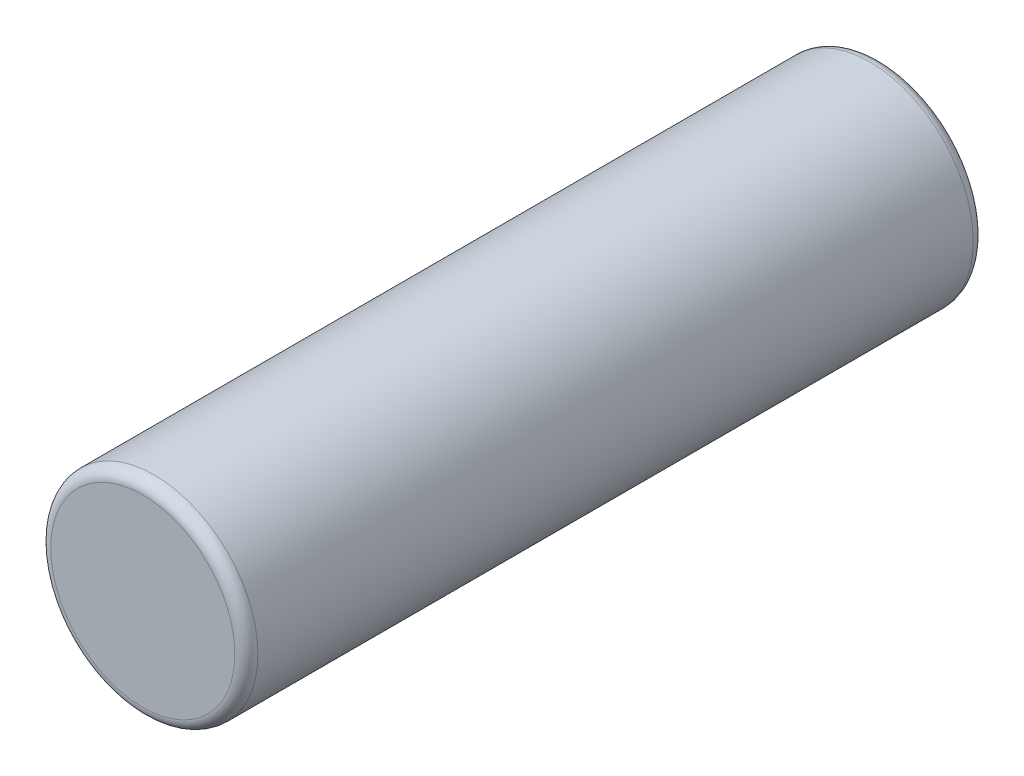
ISO-10303-21;
HEADER;
FILE_DESCRIPTION(('STEP AP214'),'2;1');
FILE_NAME('part.step','',(''),(''),'','','');
FILE_SCHEMA(('AUTOMOTIVE_DESIGN { 1 0 10303 214 1 1 1 1 }'));
ENDSEC;
DATA;
#1=APPLICATION_CONTEXT('core data for automotive mechanical design processes');
#2=APPLICATION_PROTOCOL_DEFINITION('international standard','automotive_design',2000,#1);
#3=PRODUCT_CONTEXT('',#1,'mechanical');
#4=PRODUCT('Part','Part','',(#3));
#5=PRODUCT_RELATED_PRODUCT_CATEGORY('part','',(#4));
#6=PRODUCT_DEFINITION_FORMATION('','',#4);
#7=PRODUCT_DEFINITION_CONTEXT('part definition',#1,'design');
#8=PRODUCT_DEFINITION('design','',#6,#7);
#9=PRODUCT_DEFINITION_SHAPE('','',#8);
#10=(LENGTH_UNIT() NAMED_UNIT(*) SI_UNIT(.MILLI.,.METRE.));
#11=(NAMED_UNIT(*) PLANE_ANGLE_UNIT() SI_UNIT($,.RADIAN.));
#12=(NAMED_UNIT(*) SI_UNIT($,.STERADIAN.) SOLID_ANGLE_UNIT());
#13=UNCERTAINTY_MEASURE_WITH_UNIT(LENGTH_MEASURE(1.E-05),#10,'distance_accuracy_value','');
#14=(GEOMETRIC_REPRESENTATION_CONTEXT(3) GLOBAL_UNCERTAINTY_ASSIGNED_CONTEXT((#13)) GLOBAL_UNIT_ASSIGNED_CONTEXT((#10,
#11,#12)) REPRESENTATION_CONTEXT('',''));
#15=CARTESIAN_POINT('',(0.,0.,0.));
#16=DIRECTION('',(0.,0.,1.));
#17=DIRECTION('',(1.,0.,0.));
#18=AXIS2_PLACEMENT_3D('',#15,#16,#17);
#19=CARTESIAN_POINT('',(-1.86813186813187,-1.20879120879121,63.15));
#20=DIRECTION('',(0.,0.,-1.));
#21=DIRECTION('',(-1.,0.,0.));
#22=AXIS2_PLACEMENT_3D('',#19,#20,#21);
#23=TOROIDAL_SURFACE('',#22,8.00000000000002,0.999999999999993);
#24=CARTESIAN_POINT('',(-1.86813186813187,-1.20879120879121,64.15));
#25=DIRECTION('',(0.,0.,-1.));
#26=DIRECTION('',(-1.,0.,0.));
#27=AXIS2_PLACEMENT_3D('',#24,#25,#26);
#28=CIRCLE('',#27,8.00000000000001);
#29=CARTESIAN_POINT('',(-9.86813186813188,-1.20879120879121,64.15));
#30=VERTEX_POINT('',#29);
#31=EDGE_CURVE('E10',#30,#30,#28,.T.);
#32=ORIENTED_EDGE('',*,*,#31,.T.);
#33=EDGE_LOOP('',(#32));
#34=FACE_BOUND('',#33,.T.);
#35=CARTESIAN_POINT('',(-1.86813186813187,-1.20879120879121,63.15));
#36=DIRECTION('',(0.,0.,-1.));
#37=DIRECTION('',(-1.,0.,0.));
#38=AXIS2_PLACEMENT_3D('',#35,#36,#37);
#39=CIRCLE('',#38,9.00000000000001);
#40=CARTESIAN_POINT('',(-10.8681318681319,-1.20879120879121,63.15));
#41=VERTEX_POINT('',#40);
#42=EDGE_CURVE('E69',#41,#41,#39,.T.);
#43=ORIENTED_EDGE('',*,*,#42,.F.);
#44=EDGE_LOOP('',(#43));
#45=FACE_BOUND('',#44,.T.);
#46=ADVANCED_FACE('F35',(#34,#45),#23,.T.);
#47=CARTESIAN_POINT('',(6.13186813186815,-1.20879120879121,64.15));
#48=DIRECTION('',(0.,0.,1.));
#49=DIRECTION('',(1.,0.,0.));
#50=AXIS2_PLACEMENT_3D('',#47,#48,#49);
#51=PLANE('',#50);
#52=ORIENTED_EDGE('',*,*,#31,.F.);
#53=EDGE_LOOP('',(#52));
#54=FACE_BOUND('',#53,.T.);
#55=ADVANCED_FACE('F77',(#54),#51,.T.);
#56=CARTESIAN_POINT('',(-1.86813186813187,-1.20879120879121,0.));
#57=DIRECTION('',(0.,0.,-1.));
#58=DIRECTION('',(-1.,0.,0.));
#59=AXIS2_PLACEMENT_3D('',#56,#57,#58);
#60=PLANE('',#59);
#61=CARTESIAN_POINT('',(-1.86813186813187,-1.20879120879121,0.));
#62=DIRECTION('',(0.,0.,-1.));
#63=DIRECTION('',(-1.,0.,0.));
#64=AXIS2_PLACEMENT_3D('',#61,#62,#63);
#65=CIRCLE('',#64,4.);
#66=CARTESIAN_POINT('',(-5.86813186813187,-1.20879120879121,0.));
#67=VERTEX_POINT('',#66);
#68=EDGE_CURVE('E41',#67,#67,#65,.T.);
#69=ORIENTED_EDGE('',*,*,#68,.T.);
#70=EDGE_LOOP('',(#69));
#71=FACE_BOUND('',#70,.T.);
#72=ADVANCED_FACE('F81',(#71),#60,.T.);
#73=CARTESIAN_POINT('',(-1.86813186813187,-1.20879120879121,0.5));
#74=DIRECTION('',(0.,0.,-1.));
#75=DIRECTION('',(-1.,0.,0.));
#76=AXIS2_PLACEMENT_3D('',#73,#74,#75);
#77=TOROIDAL_SURFACE('',#76,4.,0.500000000000001);
#78=CARTESIAN_POINT('',(-1.86813186813187,-1.20879120879121,0.5));
#79=DIRECTION('',(0.,0.,-1.));
#80=DIRECTION('',(-1.,0.,0.));
#81=AXIS2_PLACEMENT_3D('',#78,#79,#80);
#82=CIRCLE('',#81,4.5);
#83=CARTESIAN_POINT('',(-6.36813186813187,-1.20879120879121,0.5));
#84=VERTEX_POINT('',#83);
#85=EDGE_CURVE('E45',#84,#84,#82,.T.);
#86=ORIENTED_EDGE('',*,*,#85,.T.);
#87=EDGE_LOOP('',(#86));
#88=FACE_BOUND('',#87,.T.);
#89=ORIENTED_EDGE('',*,*,#68,.F.);
#90=EDGE_LOOP('',(#89));
#91=FACE_BOUND('',#90,.T.);
#92=ADVANCED_FACE('F86',(#88,#91),#77,.T.);
#93=CARTESIAN_POINT('',(-1.86813186813187,-1.20879120879121,64.1512539936204));
#94=DIRECTION('',(0.,0.,-1.));
#95=DIRECTION('',(-1.,0.,0.));
#96=AXIS2_PLACEMENT_3D('',#93,#94,#95);
#97=CYLINDRICAL_SURFACE('',#96,4.5);
#98=CARTESIAN_POINT('',(-1.86813186813187,-1.20879120879121,2.));
#99=DIRECTION('',(0.,0.,-1.));
#100=DIRECTION('',(-1.,0.,0.));
#101=AXIS2_PLACEMENT_3D('',#98,#99,#100);
#102=CIRCLE('',#101,4.5);
#103=CARTESIAN_POINT('',(-6.36813186813187,-1.20879120879121,2.));
#104=VERTEX_POINT('',#103);
#105=EDGE_CURVE('E49',#104,#104,#102,.T.);
#106=ORIENTED_EDGE('',*,*,#105,.T.);
#107=EDGE_LOOP('',(#106));
#108=FACE_BOUND('',#107,.T.);
#109=ORIENTED_EDGE('',*,*,#85,.F.);
#110=EDGE_LOOP('',(#109));
#111=FACE_BOUND('',#110,.T.);
#112=ADVANCED_FACE('F91',(#108,#111),#97,.T.);
#113=CARTESIAN_POINT('',(-1.86813186813187,-1.20879120879121,2.));
#114=DIRECTION('',(0.,0.,-1.));
#115=DIRECTION('',(-1.,0.,0.));
#116=AXIS2_PLACEMENT_3D('',#113,#114,#115);
#117=TOROIDAL_SURFACE('',#116,5.,0.5);
#118=CARTESIAN_POINT('',(-1.86813186813187,-1.20879120879121,2.5));
#119=DIRECTION('',(0.,0.,-1.));
#120=DIRECTION('',(-1.,0.,0.));
#121=AXIS2_PLACEMENT_3D('',#118,#119,#120);
#122=CIRCLE('',#121,5.);
#123=CARTESIAN_POINT('',(-6.86813186813187,-1.20879120879121,2.5));
#124=VERTEX_POINT('',#123);
#125=EDGE_CURVE('E54',#124,#124,#122,.T.);
#126=ORIENTED_EDGE('',*,*,#125,.T.);
#127=EDGE_LOOP('',(#126));
#128=FACE_BOUND('',#127,.T.);
#129=ORIENTED_EDGE('',*,*,#105,.F.);
#130=EDGE_LOOP('',(#129));
#131=FACE_BOUND('',#130,.T.);
#132=ADVANCED_FACE('F95',(#128,#131),#117,.F.);
#133=CARTESIAN_POINT('',(3.13186813186813,-1.20879120879121,2.5));
#134=DIRECTION('',(0.,0.,-1.));
#135=DIRECTION('',(-1.,0.,0.));
#136=AXIS2_PLACEMENT_3D('',#133,#134,#135);
#137=PLANE('',#136);
#138=CARTESIAN_POINT('',(-1.86813186813187,-1.20879120879121,2.5));
#139=DIRECTION('',(0.,0.,-1.));
#140=DIRECTION('',(-1.,0.,0.));
#141=AXIS2_PLACEMENT_3D('',#138,#139,#140);
#142=CIRCLE('',#141,6.5);
#143=CARTESIAN_POINT('',(-8.36813186813187,-1.20879120879121,2.5));
#144=VERTEX_POINT('',#143);
#145=EDGE_CURVE('E57',#144,#144,#142,.T.);
#146=ORIENTED_EDGE('',*,*,#145,.T.);
#147=EDGE_LOOP('',(#146));
#148=FACE_BOUND('',#147,.T.);
#149=ORIENTED_EDGE('',*,*,#125,.F.);
#150=EDGE_LOOP('',(#149));
#151=FACE_BOUND('',#150,.T.);
#152=ADVANCED_FACE('F99',(#148,#151),#137,.T.);
#153=CARTESIAN_POINT('',(-1.86813186813187,-1.20879120879121,64.1512539936204));
#154=DIRECTION('',(0.,0.,-1.));
#155=DIRECTION('',(-1.,0.,0.));
#156=AXIS2_PLACEMENT_3D('',#153,#154,#155);
#157=CYLINDRICAL_SURFACE('',#156,6.5);
#158=CARTESIAN_POINT('',(-1.86813186813187,-1.20879120879121,1.93649167310371));
#159=DIRECTION('',(0.,0.,-1.));
#160=DIRECTION('',(-1.,0.,0.));
#161=AXIS2_PLACEMENT_3D('',#158,#159,#160);
#162=CIRCLE('',#161,6.5);
#163=CARTESIAN_POINT('',(-8.36813186813187,-1.20879120879121,1.93649167310371));
#164=VERTEX_POINT('',#163);
#165=EDGE_CURVE('E60',#164,#164,#162,.T.);
#166=ORIENTED_EDGE('',*,*,#165,.T.);
#167=EDGE_LOOP('',(#166));
#168=FACE_BOUND('',#167,.T.);
#169=ORIENTED_EDGE('',*,*,#145,.F.);
#170=EDGE_LOOP('',(#169));
#171=FACE_BOUND('',#170,.T.);
#172=ADVANCED_FACE('F103',(#168,#171),#157,.F.);
#173=CARTESIAN_POINT('',(-1.86813186813187,-1.20879120879121,1.93649167310371));
#174=DIRECTION('',(0.,0.,-1.));
#175=DIRECTION('',(-1.,0.,0.));
#176=AXIS2_PLACEMENT_3D('',#173,#174,#175);
#177=TOROIDAL_SURFACE('',#176,8.5,2.);
#178=CARTESIAN_POINT('',(-1.86813186813187,-1.20879120879121,0.));
#179=DIRECTION('',(0.,0.,-1.));
#180=DIRECTION('',(-1.,0.,0.));
#181=AXIS2_PLACEMENT_3D('',#178,#179,#180);
#182=CIRCLE('',#181,8.);
#183=CARTESIAN_POINT('',(-9.86813186813187,-1.20879120879121,0.));
#184=VERTEX_POINT('',#183);
#185=EDGE_CURVE('E63',#184,#184,#182,.T.);
#186=ORIENTED_EDGE('',*,*,#185,.T.);
#187=EDGE_LOOP('',(#186));
#188=FACE_BOUND('',#187,.T.);
#189=ORIENTED_EDGE('',*,*,#165,.F.);
#190=EDGE_LOOP('',(#189));
#191=FACE_BOUND('',#190,.T.);
#192=ADVANCED_FACE('F107',(#188,#191),#177,.T.);
#193=CARTESIAN_POINT('',(-1.86813186813187,-1.20879120879121,1.));
#194=DIRECTION('',(0.,0.,-1.));
#195=DIRECTION('',(-1.,0.,0.));
#196=AXIS2_PLACEMENT_3D('',#193,#194,#195);
#197=TOROIDAL_SURFACE('',#196,8.,1.);
#198=CARTESIAN_POINT('',(-1.86813186813187,-1.20879120879121,1.));
#199=DIRECTION('',(0.,0.,-1.));
#200=DIRECTION('',(-1.,0.,0.));
#201=AXIS2_PLACEMENT_3D('',#198,#199,#200);
#202=CIRCLE('',#201,9.);
#203=CARTESIAN_POINT('',(-10.8681318681319,-1.20879120879121,1.));
#204=VERTEX_POINT('',#203);
#205=EDGE_CURVE('E66',#204,#204,#202,.T.);
#206=ORIENTED_EDGE('',*,*,#205,.T.);
#207=EDGE_LOOP('',(#206));
#208=FACE_BOUND('',#207,.T.);
#209=ORIENTED_EDGE('',*,*,#185,.F.);
#210=EDGE_LOOP('',(#209));
#211=FACE_BOUND('',#210,.T.);
#212=ADVANCED_FACE('F111',(#208,#211),#197,.T.);
#213=CARTESIAN_POINT('',(-1.86813186813187,-1.20879120879121,64.1512539936204));
#214=DIRECTION('',(0.,0.,-1.));
#215=DIRECTION('',(-1.,0.,0.));
#216=AXIS2_PLACEMENT_3D('',#213,#214,#215);
#217=CYLINDRICAL_SURFACE('',#216,9.00000000000001);
#218=ORIENTED_EDGE('',*,*,#42,.T.);
#219=EDGE_LOOP('',(#218));
#220=FACE_BOUND('',#219,.T.);
#221=ORIENTED_EDGE('',*,*,#205,.F.);
#222=EDGE_LOOP('',(#221));
#223=FACE_BOUND('',#222,.T.);
#224=ADVANCED_FACE('F73',(#220,#223),#217,.T.);
#225=CLOSED_SHELL('',(#46,#55,#72,#92,#112,#132,#152,#172,#192,#212,#224));
#226=MANIFOLD_SOLID_BREP('B2',#225);
#227=ADVANCED_BREP_SHAPE_REPRESENTATION('',(#18,#226),#14);
#228=SHAPE_DEFINITION_REPRESENTATION(#9,#227);
ENDSEC;
END-ISO-10303-21;
